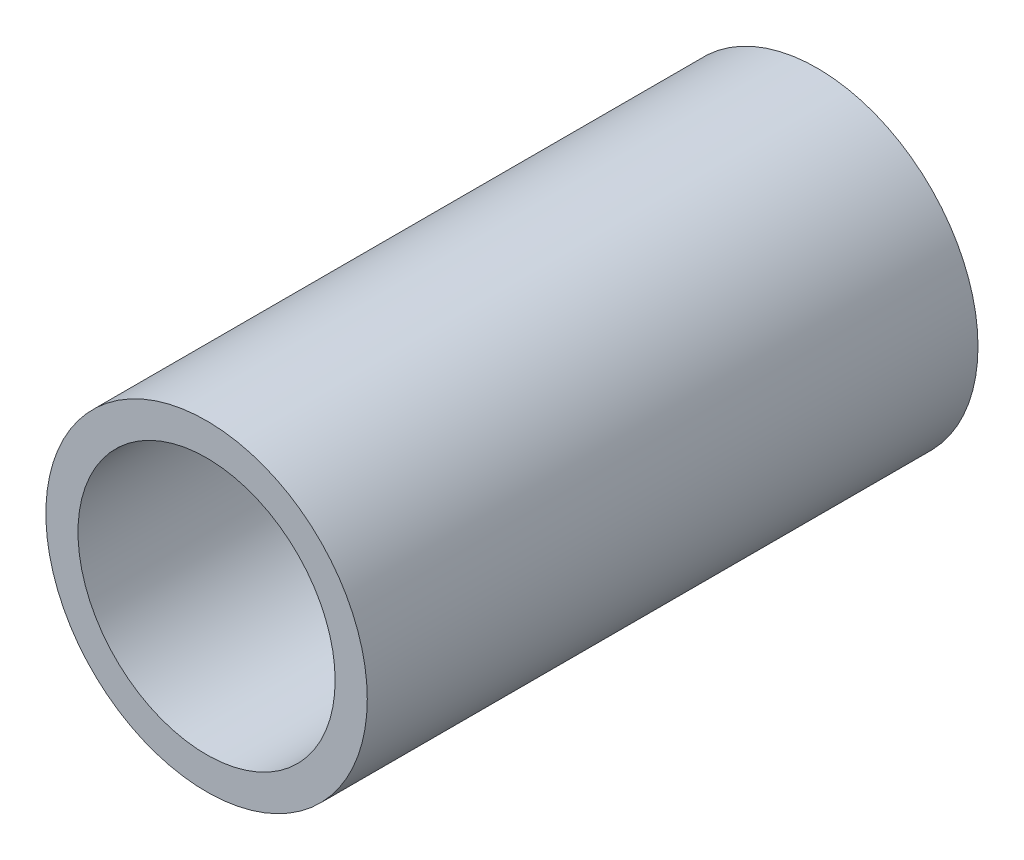
ISO-10303-21;
HEADER;
FILE_DESCRIPTION(('STEP AP214'),'2;1');
FILE_NAME('part.step','',(''),(''),'','','');
FILE_SCHEMA(('AUTOMOTIVE_DESIGN { 1 0 10303 214 1 1 1 1 }'));
ENDSEC;
DATA;
#1=APPLICATION_CONTEXT('core data for automotive mechanical design processes');
#2=APPLICATION_PROTOCOL_DEFINITION('international standard','automotive_design',2000,#1);
#3=PRODUCT_CONTEXT('',#1,'mechanical');
#4=PRODUCT('Part','Part','',(#3));
#5=PRODUCT_RELATED_PRODUCT_CATEGORY('part','',(#4));
#6=PRODUCT_DEFINITION_FORMATION('','',#4);
#7=PRODUCT_DEFINITION_CONTEXT('part definition',#1,'design');
#8=PRODUCT_DEFINITION('design','',#6,#7);
#9=PRODUCT_DEFINITION_SHAPE('','',#8);
#10=(LENGTH_UNIT() NAMED_UNIT(*) SI_UNIT(.MILLI.,.METRE.));
#11=(NAMED_UNIT(*) PLANE_ANGLE_UNIT() SI_UNIT($,.RADIAN.));
#12=(NAMED_UNIT(*) SI_UNIT($,.STERADIAN.) SOLID_ANGLE_UNIT());
#13=UNCERTAINTY_MEASURE_WITH_UNIT(LENGTH_MEASURE(1.E-05),#10,'distance_accuracy_value','');
#14=(GEOMETRIC_REPRESENTATION_CONTEXT(3) GLOBAL_UNCERTAINTY_ASSIGNED_CONTEXT((#13)) GLOBAL_UNIT_ASSIGNED_CONTEXT((#10,
#11,#12)) REPRESENTATION_CONTEXT('',''));
#15=CARTESIAN_POINT('',(0.,0.,0.));
#16=DIRECTION('',(0.,0.,1.));
#17=DIRECTION('',(1.,0.,0.));
#18=AXIS2_PLACEMENT_3D('',#15,#16,#17);
#19=CARTESIAN_POINT('',(0.,0.,19.));
#20=DIRECTION('',(0.,0.,1.));
#21=DIRECTION('',(1.,0.,0.));
#22=AXIS2_PLACEMENT_3D('',#19,#20,#21);
#23=PLANE('',#22);
#24=CARTESIAN_POINT('',(0.,0.,19.));
#25=DIRECTION('',(0.,0.,1.));
#26=DIRECTION('',(1.,0.,0.));
#27=AXIS2_PLACEMENT_3D('',#24,#25,#26);
#28=CIRCLE('',#27,5.);
#29=CARTESIAN_POINT('',(5.,0.,19.));
#30=VERTEX_POINT('',#29);
#31=EDGE_CURVE('E10',#30,#30,#28,.T.);
#32=ORIENTED_EDGE('',*,*,#31,.T.);
#33=EDGE_LOOP('',(#32));
#34=FACE_BOUND('',#33,.T.);
#35=CARTESIAN_POINT('',(0.,0.,19.));
#36=DIRECTION('',(0.,0.,1.));
#37=DIRECTION('',(1.,0.,0.));
#38=AXIS2_PLACEMENT_3D('',#35,#36,#37);
#39=CIRCLE('',#38,4.);
#40=CARTESIAN_POINT('',(4.,0.,19.));
#41=VERTEX_POINT('',#40);
#42=EDGE_CURVE('E45',#41,#41,#39,.T.);
#43=ORIENTED_EDGE('',*,*,#42,.F.);
#44=EDGE_LOOP('',(#43));
#45=FACE_BOUND('',#44,.T.);
#46=ADVANCED_FACE('F34',(#34,#45),#23,.T.);
#47=CARTESIAN_POINT('',(0.,0.,0.));
#48=DIRECTION('',(0.,0.,1.));
#49=DIRECTION('',(1.,0.,0.));
#50=AXIS2_PLACEMENT_3D('',#47,#48,#49);
#51=PLANE('',#50);
#52=CARTESIAN_POINT('',(0.,0.,0.));
#53=DIRECTION('',(0.,0.,1.));
#54=DIRECTION('',(1.,0.,0.));
#55=AXIS2_PLACEMENT_3D('',#52,#53,#54);
#56=CIRCLE('',#55,5.);
#57=CARTESIAN_POINT('',(5.,0.,0.));
#58=VERTEX_POINT('',#57);
#59=EDGE_CURVE('E38',#58,#58,#56,.T.);
#60=ORIENTED_EDGE('',*,*,#59,.F.);
#61=EDGE_LOOP('',(#60));
#62=FACE_BOUND('',#61,.T.);
#63=CARTESIAN_POINT('',(0.,0.,0.));
#64=DIRECTION('',(0.,0.,1.));
#65=DIRECTION('',(1.,0.,0.));
#66=AXIS2_PLACEMENT_3D('',#63,#64,#65);
#67=CIRCLE('',#66,4.);
#68=CARTESIAN_POINT('',(4.,0.,0.));
#69=VERTEX_POINT('',#68);
#70=EDGE_CURVE('E47',#69,#69,#67,.T.);
#71=ORIENTED_EDGE('',*,*,#70,.T.);
#72=EDGE_LOOP('',(#71));
#73=FACE_BOUND('',#72,.T.);
#74=ADVANCED_FACE('F57',(#62,#73),#51,.F.);
#75=CARTESIAN_POINT('',(0.,0.,19.));
#76=DIRECTION('',(0.,0.,-1.));
#77=DIRECTION('',(-1.,0.,0.));
#78=AXIS2_PLACEMENT_3D('',#75,#76,#77);
#79=CYLINDRICAL_SURFACE('',#78,5.);
#80=ORIENTED_EDGE('',*,*,#31,.F.);
#81=EDGE_LOOP('',(#80));
#82=FACE_BOUND('',#81,.T.);
#83=ORIENTED_EDGE('',*,*,#59,.T.);
#84=EDGE_LOOP('',(#83));
#85=FACE_BOUND('',#84,.T.);
#86=ADVANCED_FACE('F36',(#82,#85),#79,.T.);
#87=CARTESIAN_POINT('',(0.,0.,19.));
#88=DIRECTION('',(0.,0.,-1.));
#89=DIRECTION('',(-1.,0.,0.));
#90=AXIS2_PLACEMENT_3D('',#87,#88,#89);
#91=CYLINDRICAL_SURFACE('',#90,4.);
#92=ORIENTED_EDGE('',*,*,#42,.T.);
#93=EDGE_LOOP('',(#92));
#94=FACE_BOUND('',#93,.T.);
#95=ORIENTED_EDGE('',*,*,#70,.F.);
#96=EDGE_LOOP('',(#95));
#97=FACE_BOUND('',#96,.T.);
#98=ADVANCED_FACE('F53',(#94,#97),#91,.F.);
#99=CLOSED_SHELL('',(#46,#74,#86,#98));
#100=MANIFOLD_SOLID_BREP('B2',#99);
#101=ADVANCED_BREP_SHAPE_REPRESENTATION('',(#18,#100),#14);
#102=SHAPE_DEFINITION_REPRESENTATION(#9,#101);
ENDSEC;
END-ISO-10303-21;
